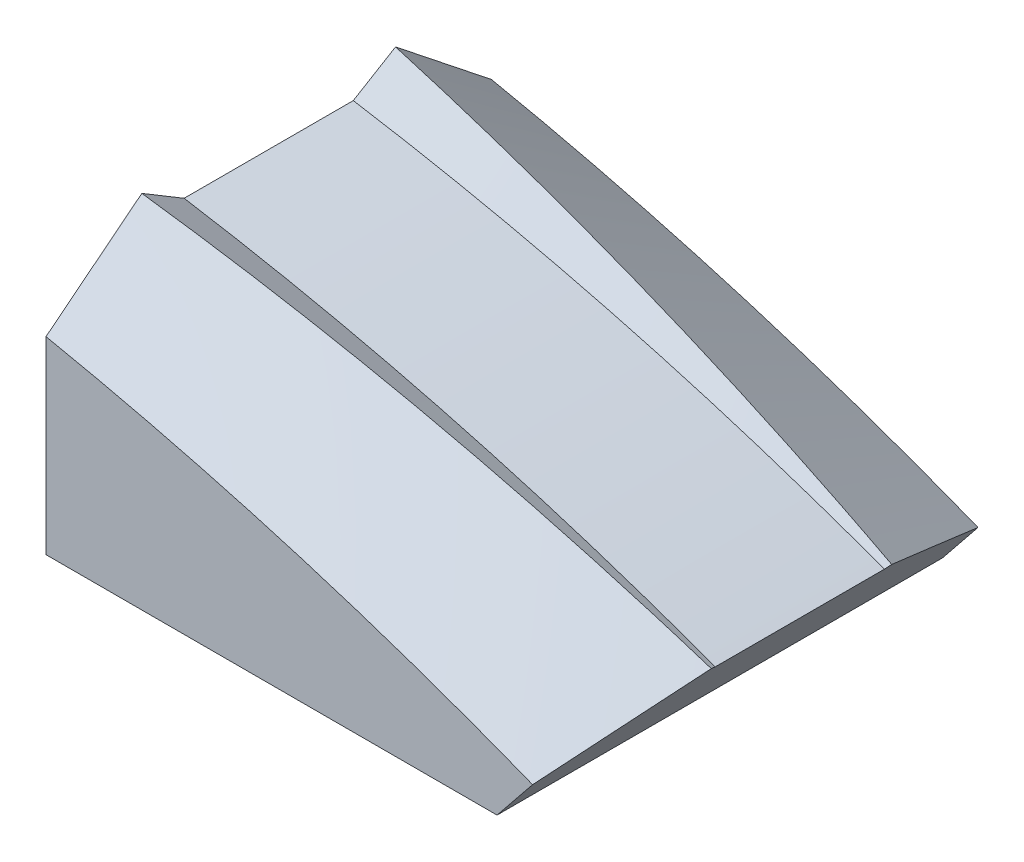
ISO-10303-21;
HEADER;
FILE_DESCRIPTION(('STEP AP214'),'2;1');
FILE_NAME('part.step','',(''),(''),'','','');
FILE_SCHEMA(('AUTOMOTIVE_DESIGN { 1 0 10303 214 1 1 1 1 }'));
ENDSEC;
DATA;
#1=APPLICATION_CONTEXT('core data for automotive mechanical design processes');
#2=APPLICATION_PROTOCOL_DEFINITION('international standard','automotive_design',2000,#1);
#3=PRODUCT_CONTEXT('',#1,'mechanical');
#4=PRODUCT('Part','Part','',(#3));
#5=PRODUCT_RELATED_PRODUCT_CATEGORY('part','',(#4));
#6=PRODUCT_DEFINITION_FORMATION('','',#4);
#7=PRODUCT_DEFINITION_CONTEXT('part definition',#1,'design');
#8=PRODUCT_DEFINITION('design','',#6,#7);
#9=PRODUCT_DEFINITION_SHAPE('','',#8);
#10=(LENGTH_UNIT() NAMED_UNIT(*) SI_UNIT(.MILLI.,.METRE.));
#11=(NAMED_UNIT(*) PLANE_ANGLE_UNIT() SI_UNIT($,.RADIAN.));
#12=(NAMED_UNIT(*) SI_UNIT($,.STERADIAN.) SOLID_ANGLE_UNIT());
#13=UNCERTAINTY_MEASURE_WITH_UNIT(LENGTH_MEASURE(1.E-05),#10,'distance_accuracy_value','');
#14=(GEOMETRIC_REPRESENTATION_CONTEXT(3) GLOBAL_UNCERTAINTY_ASSIGNED_CONTEXT((#13)) GLOBAL_UNIT_ASSIGNED_CONTEXT((#10,
#11,#12)) REPRESENTATION_CONTEXT('',''));
#15=CARTESIAN_POINT('',(0.,0.,0.));
#16=DIRECTION('',(0.,0.,1.));
#17=DIRECTION('',(1.,0.,0.));
#18=AXIS2_PLACEMENT_3D('',#15,#16,#17);
#19=CARTESIAN_POINT('',(0.,9.4,0.));
#20=DIRECTION('',(1.,0.,0.));
#21=DIRECTION('',(0.,0.,-1.));
#22=AXIS2_PLACEMENT_3D('',#19,#20,#21);
#23=PLANE('',#22);
#24=DIRECTION('',(0.,0.621882143601586,0.783110847498294));
#25=VECTOR('',#24,1.);
#26=CARTESIAN_POINT('',(0.,9.4,3.4));
#27=LINE('',#26,#25);
#28=CARTESIAN_POINT('',(0.,6.7,0.));
#29=VERTEX_POINT('',#28);
#30=CARTESIAN_POINT('',(0.,9.4,3.4));
#31=VERTEX_POINT('',#30);
#32=EDGE_CURVE('E402',#29,#31,#27,.T.);
#33=ORIENTED_EDGE('',*,*,#32,.F.);
#34=DIRECTION('',(0.,-1.,0.));
#35=VECTOR('',#34,1.);
#36=CARTESIAN_POINT('',(0.,9.4,0.));
#37=LINE('',#36,#35);
#38=CARTESIAN_POINT('',(0.,0.,0.));
#39=VERTEX_POINT('',#38);
#40=EDGE_CURVE('E368',#29,#39,#37,.T.);
#41=ORIENTED_EDGE('',*,*,#40,.T.);
#42=DIRECTION('',(0.,0.,1.));
#43=VECTOR('',#42,1.);
#44=CARTESIAN_POINT('',(0.,0.,0.));
#45=LINE('',#44,#43);
#46=CARTESIAN_POINT('',(0.,0.,15.8));
#47=VERTEX_POINT('',#46);
#48=EDGE_CURVE('E366',#39,#47,#45,.T.);
#49=ORIENTED_EDGE('',*,*,#48,.T.);
#50=DIRECTION('',(0.,-1.,0.));
#51=VECTOR('',#50,1.);
#52=CARTESIAN_POINT('',(0.,9.4,15.8));
#53=LINE('',#52,#51);
#54=CARTESIAN_POINT('',(0.,6.7,15.8));
#55=VERTEX_POINT('',#54);
#56=EDGE_CURVE('E163',#55,#47,#53,.T.);
#57=ORIENTED_EDGE('',*,*,#56,.F.);
#58=DIRECTION('',(0.,0.621882143601586,-0.783110847498294));
#59=VECTOR('',#58,1.);
#60=CARTESIAN_POINT('',(0.,4.18880839856923,18.9622412758758));
#61=LINE('',#60,#59);
#62=CARTESIAN_POINT('',(0.,9.4,12.4));
#63=VERTEX_POINT('',#62);
#64=EDGE_CURVE('E388',#55,#63,#61,.T.);
#65=ORIENTED_EDGE('',*,*,#64,.T.);
#66=DIRECTION('',(0.,0.514495755427527,0.857492925712544));
#67=VECTOR('',#66,1.);
#68=CARTESIAN_POINT('',(0.,8.5,10.9));
#69=LINE('',#68,#67);
#70=CARTESIAN_POINT('',(0.,8.5,10.9));
#71=VERTEX_POINT('',#70);
#72=EDGE_CURVE('E399',#71,#63,#69,.T.);
#73=ORIENTED_EDGE('',*,*,#72,.F.);
#74=DIRECTION('',(0.,0.,1.));
#75=VECTOR('',#74,1.);
#76=CARTESIAN_POINT('',(0.,8.5,4.9));
#77=LINE('',#76,#75);
#78=CARTESIAN_POINT('',(0.,8.5,4.9));
#79=VERTEX_POINT('',#78);
#80=EDGE_CURVE('E370',#79,#71,#77,.T.);
#81=ORIENTED_EDGE('',*,*,#80,.F.);
#82=DIRECTION('',(0.,-0.514495755427526,0.857492925712544));
#83=VECTOR('',#82,1.);
#84=CARTESIAN_POINT('',(0.,8.5,4.9));
#85=LINE('',#84,#83);
#86=EDGE_CURVE('E393',#31,#79,#85,.T.);
#87=ORIENTED_EDGE('',*,*,#86,.F.);
#88=EDGE_LOOP('',(#33,#41,#49,#57,#65,#73,#81,#87));
#89=FACE_BOUND('',#88,.T.);
#90=ADVANCED_FACE('F149',(#89),#23,.F.);
#91=CARTESIAN_POINT('',(0.,9.4,15.8));
#92=DIRECTION('',(0.,0.,-1.));
#93=DIRECTION('',(-1.,0.,0.));
#94=AXIS2_PLACEMENT_3D('',#91,#92,#93);
#95=PLANE('',#94);
#96=DIRECTION('',(1.,0.,0.));
#97=VECTOR('',#96,1.);
#98=CARTESIAN_POINT('',(0.,0.,15.8));
#99=LINE('',#98,#97);
#100=CARTESIAN_POINT('',(16.,0.,15.8));
#101=VERTEX_POINT('',#100);
#102=EDGE_CURVE('E358',#47,#101,#99,.T.);
#103=ORIENTED_EDGE('',*,*,#102,.T.);
#104=DIRECTION('',(-0.627329537872645,-0.778753909083282,0.));
#105=VECTOR('',#104,1.);
#106=CARTESIAN_POINT('',(18.9,3.6,15.8));
#107=LINE('',#106,#105);
#108=CARTESIAN_POINT('',(17.2609947401908,1.56537278092651,15.8));
#109=VERTEX_POINT('',#108);
#110=EDGE_CURVE('E278',#109,#101,#107,.T.);
#111=ORIENTED_EDGE('',*,*,#110,.F.);
#112=CARTESIAN_POINT('',(0.,6.7,15.8));
#113=CARTESIAN_POINT('',(6.4865817093124,5.3762216082445,15.8));
#114=CARTESIAN_POINT('',(12.7865817093124,3.44288827491117,15.8));
#115=CARTESIAN_POINT('',(18.9,0.9,15.8));
#116=B_SPLINE_CURVE_WITH_KNOTS('',3,(#112,#113,#114,#115),.UNSPECIFIED.,.F.,.F.,(4,4),(0.,1.),.UNSPECIFIED.);
#117=EDGE_CURVE('E404',#55,#109,#116,.T.);
#118=ORIENTED_EDGE('',*,*,#117,.F.);
#119=ORIENTED_EDGE('',*,*,#56,.T.);
#120=EDGE_LOOP('',(#103,#111,#118,#119));
#121=FACE_BOUND('',#120,.T.);
#122=ADVANCED_FACE('F347',(#121),#95,.F.);
#123=CARTESIAN_POINT('',(0.,9.4,0.));
#124=DIRECTION('',(0.,0.,1.));
#125=DIRECTION('',(1.,0.,0.));
#126=AXIS2_PLACEMENT_3D('',#123,#124,#125);
#127=PLANE('',#126);
#128=CARTESIAN_POINT('',(0.,6.7,0.));
#129=CARTESIAN_POINT('',(6.4865817093124,5.3762216082445,0.));
#130=CARTESIAN_POINT('',(12.7865817093124,3.44288827491116,0.));
#131=CARTESIAN_POINT('',(18.9,0.899999999999999,0.));
#132=B_SPLINE_CURVE_WITH_KNOTS('',3,(#128,#129,#130,#131),.UNSPECIFIED.,.F.,.F.,(4,4),(0.,1.),.UNSPECIFIED.);
#133=CARTESIAN_POINT('',(17.2609947408899,1.56537278206726,0.));
#134=VERTEX_POINT('',#133);
#135=EDGE_CURVE('E405',#29,#134,#132,.T.);
#136=ORIENTED_EDGE('',*,*,#135,.T.);
#137=DIRECTION('',(-0.627329537872645,-0.778753909083282,0.));
#138=VECTOR('',#137,1.);
#139=CARTESIAN_POINT('',(14.2955545156762,-2.11586335985027,0.));
#140=LINE('',#139,#138);
#141=CARTESIAN_POINT('',(16.,0.,0.));
#142=VERTEX_POINT('',#141);
#143=EDGE_CURVE('E178',#134,#142,#140,.T.);
#144=ORIENTED_EDGE('',*,*,#143,.T.);
#145=DIRECTION('',(-1.,0.,0.));
#146=VECTOR('',#145,1.);
#147=CARTESIAN_POINT('',(0.,0.,0.));
#148=LINE('',#147,#146);
#149=EDGE_CURVE('E365',#142,#39,#148,.T.);
#150=ORIENTED_EDGE('',*,*,#149,.T.);
#151=ORIENTED_EDGE('',*,*,#40,.F.);
#152=EDGE_LOOP('',(#136,#144,#150,#151));
#153=FACE_BOUND('',#152,.T.);
#154=ADVANCED_FACE('F344',(#153),#127,.F.);
#155=CARTESIAN_POINT('',(0.,0.,15.8));
#156=DIRECTION('',(0.,1.,0.));
#157=DIRECTION('',(0.,0.,1.));
#158=AXIS2_PLACEMENT_3D('',#155,#156,#157);
#159=PLANE('',#158);
#160=DIRECTION('',(-1.,0.,0.));
#161=VECTOR('',#160,1.);
#162=CARTESIAN_POINT('',(1.5,0.,14.3));
#163=LINE('',#162,#161);
#164=CARTESIAN_POINT('',(14.5,0.,14.3));
#165=VERTEX_POINT('',#164);
#166=CARTESIAN_POINT('',(1.5,0.,14.3));
#167=VERTEX_POINT('',#166);
#168=EDGE_CURVE('E272',#165,#167,#163,.T.);
#169=ORIENTED_EDGE('',*,*,#168,.F.);
#170=DIRECTION('',(0.,0.,1.));
#171=VECTOR('',#170,1.);
#172=CARTESIAN_POINT('',(14.5,0.,14.3));
#173=LINE('',#172,#171);
#174=CARTESIAN_POINT('',(14.5,0.,1.5));
#175=VERTEX_POINT('',#174);
#176=EDGE_CURVE('E170',#175,#165,#173,.T.);
#177=ORIENTED_EDGE('',*,*,#176,.F.);
#178=DIRECTION('',(1.,0.,0.));
#179=VECTOR('',#178,1.);
#180=CARTESIAN_POINT('',(1.5,0.,1.5));
#181=LINE('',#180,#179);
#182=CARTESIAN_POINT('',(1.5,0.,1.5));
#183=VERTEX_POINT('',#182);
#184=EDGE_CURVE('E263',#183,#175,#181,.T.);
#185=ORIENTED_EDGE('',*,*,#184,.F.);
#186=DIRECTION('',(0.,0.,-1.));
#187=VECTOR('',#186,1.);
#188=CARTESIAN_POINT('',(1.5,0.,14.3));
#189=LINE('',#188,#187);
#190=EDGE_CURVE('E266',#167,#183,#189,.T.);
#191=ORIENTED_EDGE('',*,*,#190,.F.);
#192=EDGE_LOOP('',(#169,#177,#185,#191));
#193=FACE_BOUND('',#192,.T.);
#194=ORIENTED_EDGE('',*,*,#149,.F.);
#195=DIRECTION('',(0.,0.,1.));
#196=VECTOR('',#195,1.);
#197=CARTESIAN_POINT('',(16.,0.,-9.99999999994061E-05));
#198=LINE('',#197,#196);
#199=EDGE_CURVE('E283',#142,#101,#198,.T.);
#200=ORIENTED_EDGE('',*,*,#199,.T.);
#201=ORIENTED_EDGE('',*,*,#102,.F.);
#202=ORIENTED_EDGE('',*,*,#48,.F.);
#203=EDGE_LOOP('',(#194,#200,#201,#202));
#204=FACE_BOUND('',#203,.T.);
#205=ADVANCED_FACE('F336',(#193,#204),#159,.F.);
#206=CARTESIAN_POINT('',(0.,8.5,10.9));
#207=CARTESIAN_POINT('',(6.4865817093124,7.44288827491116,10.9));
#208=CARTESIAN_POINT('',(12.7865817093124,5.7762216082445,10.9));
#209=CARTESIAN_POINT('',(18.9,3.5,10.9));
#210=CARTESIAN_POINT('',(0.,8.5,8.9));
#211=CARTESIAN_POINT('',(6.48658170931239,7.44288827491116,8.9));
#212=CARTESIAN_POINT('',(12.7865817093124,5.7762216082445,8.9));
#213=CARTESIAN_POINT('',(18.9,3.5,8.9));
#214=CARTESIAN_POINT('',(0.,8.5,6.9));
#215=CARTESIAN_POINT('',(6.48658170931239,7.44288827491116,6.9));
#216=CARTESIAN_POINT('',(12.7865817093124,5.7762216082445,6.9));
#217=CARTESIAN_POINT('',(18.9,3.5,6.9));
#218=CARTESIAN_POINT('',(0.,8.5,4.9));
#219=CARTESIAN_POINT('',(6.48658170931239,7.44288827491116,4.9));
#220=CARTESIAN_POINT('',(12.7865817093124,5.7762216082445,4.9));
#221=CARTESIAN_POINT('',(18.9,3.5,4.9));
#222=B_SPLINE_SURFACE_WITH_KNOTS('',3,3,((#206,#207,#208,#209),(#210,#211,#212,#213),(#214,#215,
#216,#217),(#218,#219,#220,#221)),.UNSPECIFIED.,.F.,.F.,.F.,(4,4),(4,4),(0.,1.),(0.,1.),.UNSPECIFIED.);
#223=CARTESIAN_POINT('',(0.,8.5,10.9));
#224=CARTESIAN_POINT('',(6.4865817093124,7.44288827491116,10.9));
#225=CARTESIAN_POINT('',(12.7865817093124,5.7762216082445,10.9));
#226=CARTESIAN_POINT('',(18.9,3.5,10.9));
#227=B_SPLINE_CURVE_WITH_KNOTS('',3,(#223,#224,#225,#226),.UNSPECIFIED.,.F.,.F.,(4,4),(0.,1.),.UNSPECIFIED.);
#228=CARTESIAN_POINT('',(18.8380166338539,3.52305513168063,10.9));
#229=VERTEX_POINT('',#228);
#230=EDGE_CURVE('E441',#229,#71,#227,.F.);
#231=DIRECTION('',(0.,0.,-1.));
#232=VECTOR('',#231,1.);
#233=CARTESIAN_POINT('',(18.8380166338539,3.52305513168063,7.9));
#234=LINE('',#233,#232);
#235=CARTESIAN_POINT('',(18.838016631898,3.52305513185555,4.9));
#236=VERTEX_POINT('',#235);
#237=EDGE_CURVE('E289',#229,#236,#234,.T.);
#238=CARTESIAN_POINT('',(0.,8.5,4.9));
#239=CARTESIAN_POINT('',(6.48658170931239,7.44288827491116,4.9));
#240=CARTESIAN_POINT('',(12.7865817093124,5.7762216082445,4.9));
#241=CARTESIAN_POINT('',(18.9,3.5,4.9));
#242=B_SPLINE_CURVE_WITH_KNOTS('',3,(#238,#239,#240,#241),.UNSPECIFIED.,.F.,.F.,(4,4),(0.,1.),.UNSPECIFIED.);
#243=EDGE_CURVE('E437',#79,#236,#242,.T.);
#244=ORIENTED_EDGE('',*,*,#230,.F.);
#245=ORIENTED_EDGE('',*,*,#237,.T.);
#246=ORIENTED_EDGE('',*,*,#243,.F.);
#247=ORIENTED_EDGE('',*,*,#80,.T.);
#248=EDGE_LOOP('',(#244,#245,#246,#247));
#249=FACE_BOUND('',#248,.T.);
#250=ADVANCED_FACE('F334',(#249),#222,.F.);
#251=CARTESIAN_POINT('',(0.,9.4,12.4));
#252=CARTESIAN_POINT('',(6.4865817093124,8.0762216082445,11.9666666666667));
#253=CARTESIAN_POINT('',(12.7865817093124,6.14288827491117,11.5333333333333));
#254=CARTESIAN_POINT('',(18.9,3.6,11.1));
#255=CARTESIAN_POINT('',(0.,9.325,12.275));
#256=CARTESIAN_POINT('',(6.4865817093124,8.02344383046672,11.8777777777778));
#257=CARTESIAN_POINT('',(12.7865817093124,6.11233271935561,11.4805555555556));
#258=CARTESIAN_POINT('',(18.9,3.59166666666667,11.0833333333333));
#259=CARTESIAN_POINT('',(0.,9.17500000000001,12.025));
#260=CARTESIAN_POINT('',(6.48658170931238,7.91788827491117,11.7));
#261=CARTESIAN_POINT('',(12.7865817093124,6.0512216082445,11.375));
#262=CARTESIAN_POINT('',(18.9,3.575,11.05));
#263=CARTESIAN_POINT('',(0.,8.95,11.65));
#264=CARTESIAN_POINT('',(6.48658170931241,7.75955494157783,11.4333333333333));
#265=CARTESIAN_POINT('',(12.7865817093124,5.95955494157783,11.2166666666667));
#266=CARTESIAN_POINT('',(18.9,3.55,11.));
#267=CARTESIAN_POINT('',(0.,8.725,11.275));
#268=CARTESIAN_POINT('',(6.48658170931239,7.6012216082445,11.1666666666667));
#269=CARTESIAN_POINT('',(12.7865817093124,5.86788827491117,11.0583333333333));
#270=CARTESIAN_POINT('',(18.9,3.525,10.95));
#271=CARTESIAN_POINT('',(0.,8.575,11.025));
#272=CARTESIAN_POINT('',(6.4865817093124,7.49566605268894,10.9888888888889));
#273=CARTESIAN_POINT('',(12.7865817093124,5.80677716380005,10.9527777777778));
#274=CARTESIAN_POINT('',(18.9,3.50833333333333,10.9166666666667));
#275=CARTESIAN_POINT('',(0.,8.5,10.9));
#276=CARTESIAN_POINT('',(6.4865817093124,7.44288827491116,10.9));
#277=CARTESIAN_POINT('',(12.7865817093124,5.7762216082445,10.9));
#278=CARTESIAN_POINT('',(18.9,3.5,10.9));
#279=B_SPLINE_SURFACE_WITH_KNOTS('',3,3,((#251,#252,#253,#254),(#255,#256,#257,#258),(#259,#260,
#261,#262),(#263,#264,#265,#266),(#267,#268,#269,#270),(#271,#272,#273,#274),(#275,#276,#277,
#278)),.UNSPECIFIED.,.F.,.F.,.F.,(4,1,1,1,4),(4,4),(0.913253710140628,0.934940282605471,
0.956626855070314,0.978313427535157,1.),(0.,1.),.UNSPECIFIED.);
#280=CARTESIAN_POINT('',(0.,9.4,12.4));
#281=CARTESIAN_POINT('',(6.4865817093124,8.0762216082445,11.9666666666667));
#282=CARTESIAN_POINT('',(12.7865817093124,6.14288827491117,11.5333333333333));
#283=CARTESIAN_POINT('',(18.9,3.6,11.1));
#284=B_SPLINE_CURVE_WITH_KNOTS('',3,(#280,#281,#282,#283),.UNSPECIFIED.,.F.,.F.,(4,4),(0.,1.),.UNSPECIFIED.);
#285=CARTESIAN_POINT('',(18.9,3.6,11.1));
#286=VERTEX_POINT('',#285);
#287=EDGE_CURVE('E387',#63,#286,#284,.T.);
#288=CARTESIAN_POINT('',(18.9,3.6,11.1));
#289=CARTESIAN_POINT('',(18.8948566609703,3.59361516534244,11.0833161418808));
#290=CARTESIAN_POINT('',(18.8897077414871,3.58722340322541,11.0666366549513));
#291=CARTESIAN_POINT('',(18.8768216580605,3.57122688586826,11.0249486895645));
#292=CARTESIAN_POINT('',(18.8690776108991,3.56161358594374,10.9999456168862));
#293=CARTESIAN_POINT('',(18.8535652173693,3.54235682156185,10.9499585573523));
#294=CARTESIAN_POINT('',(18.8457968709422,3.53271335703173,10.9249745705428));
#295=CARTESIAN_POINT('',(18.8380166337189,3.52305513151313,10.8999999995668));
#296=B_SPLINE_CURVE_WITH_KNOTS('',3,(#288,#289,#290,#291,#292,#293,#294,#295),.UNSPECIFIED.,.F.,
.F.,(4,2,2,4),(0.,0.0557686325096558,0.139421780360968,0.223075130138921),.UNSPECIFIED.);
#297=EDGE_CURVE('E326',#286,#229,#296,.T.);
#298=ORIENTED_EDGE('',*,*,#287,.T.);
#299=ORIENTED_EDGE('',*,*,#297,.T.);
#300=ORIENTED_EDGE('',*,*,#230,.T.);
#301=ORIENTED_EDGE('',*,*,#72,.T.);
#302=EDGE_LOOP('',(#298,#299,#300,#301));
#303=FACE_BOUND('',#302,.T.);
#304=ADVANCED_FACE('F328',(#303),#279,.F.);
#305=CARTESIAN_POINT('',(0.,8.5,4.9));
#306=CARTESIAN_POINT('',(6.48658170931239,7.44288827491116,4.9));
#307=CARTESIAN_POINT('',(12.7865817093124,5.7762216082445,4.9));
#308=CARTESIAN_POINT('',(18.9,3.5,4.9));
#309=CARTESIAN_POINT('',(0.,8.575,4.775));
#310=CARTESIAN_POINT('',(6.4865817093124,7.49566605268894,4.81111111111111));
#311=CARTESIAN_POINT('',(12.7865817093124,5.80677716380005,4.84722222222222));
#312=CARTESIAN_POINT('',(18.9,3.50833333333333,4.88333333333333));
#313=CARTESIAN_POINT('',(0.,8.725,4.525));
#314=CARTESIAN_POINT('',(6.4865817093124,7.6012216082445,4.63333333333334));
#315=CARTESIAN_POINT('',(12.7865817093124,5.86788827491117,4.74166666666667));
#316=CARTESIAN_POINT('',(18.9,3.52500000000001,4.85));
#317=CARTESIAN_POINT('',(0.,8.95000000000001,4.15));
#318=CARTESIAN_POINT('',(6.48658170931239,7.75955494157784,4.36666666666667));
#319=CARTESIAN_POINT('',(12.7865817093124,5.95955494157783,4.58333333333333));
#320=CARTESIAN_POINT('',(18.9,3.54999999999999,4.8));
#321=CARTESIAN_POINT('',(0.,9.17499999999999,3.775));
#322=CARTESIAN_POINT('',(6.48658170931239,7.91788827491116,4.1));
#323=CARTESIAN_POINT('',(12.7865817093124,6.0512216082445,4.425));
#324=CARTESIAN_POINT('',(18.9,3.575,4.75));
#325=CARTESIAN_POINT('',(0.,9.325,3.525));
#326=CARTESIAN_POINT('',(6.4865817093124,8.02344383046672,3.92222222222222));
#327=CARTESIAN_POINT('',(12.7865817093124,6.11233271935561,4.31944444444445));
#328=CARTESIAN_POINT('',(18.9,3.59166666666667,4.71666666666667));
#329=CARTESIAN_POINT('',(0.,9.4,3.4));
#330=CARTESIAN_POINT('',(6.48658170931239,8.0762216082445,3.83333333333333));
#331=CARTESIAN_POINT('',(12.7865817093124,6.14288827491116,4.26666666666667));
#332=CARTESIAN_POINT('',(18.9,3.6,4.7));
#333=B_SPLINE_SURFACE_WITH_KNOTS('',3,3,((#305,#306,#307,#308),(#309,#310,#311,#312),(#313,#314,
#315,#316),(#317,#318,#319,#320),(#321,#322,#323,#324),(#325,#326,#327,#328),(#329,#330,#331,
#332)),.UNSPECIFIED.,.F.,.F.,.F.,(4,1,1,1,4),(4,4),(0.,0.021686572464843,0.0433731449296861,
0.0650597173945291,0.0867462898593722),(0.,1.),.UNSPECIFIED.);
#334=CARTESIAN_POINT('',(18.838016631898,3.52305513185555,4.9));
#335=CARTESIAN_POINT('',(18.8483902394587,3.5359327117751,4.86670070782169));
#336=CARTESIAN_POINT('',(18.8587427057247,3.54878404863036,4.83338468513675));
#337=CARTESIAN_POINT('',(18.8742388285131,3.56802061463362,4.78338492118203));
#338=CARTESIAN_POINT('',(18.8793987832911,3.57442607577351,4.76671401260157));
#339=CARTESIAN_POINT('',(18.8897076854756,3.58722333373001,4.73336352687561));
#340=CARTESIAN_POINT('',(18.8948566328699,3.59361513053151,4.71668394972057));
#341=CARTESIAN_POINT('',(18.9,3.6,4.7));
#342=B_SPLINE_CURVE_WITH_KNOTS('',3,(#334,#335,#336,#337,#338,#339,#340,#341),.UNSPECIFIED.,.F.,
.F.,(4,2,2,4),(0.,0.111537315841545,0.167306189529654,0.223075124761566),.UNSPECIFIED.);
#343=CARTESIAN_POINT('',(18.9,3.6,4.7));
#344=VERTEX_POINT('',#343);
#345=EDGE_CURVE('E286',#236,#344,#342,.T.);
#346=CARTESIAN_POINT('',(0.,9.4,3.4));
#347=CARTESIAN_POINT('',(6.48658170931239,8.0762216082445,3.83333333333333));
#348=CARTESIAN_POINT('',(12.7865817093124,6.14288827491116,4.26666666666667));
#349=CARTESIAN_POINT('',(18.9,3.6,4.7));
#350=B_SPLINE_CURVE_WITH_KNOTS('',3,(#346,#347,#348,#349),.UNSPECIFIED.,.F.,.F.,(4,4),(0.,1.),.UNSPECIFIED.);
#351=EDGE_CURVE('E384',#31,#344,#350,.T.);
#352=ORIENTED_EDGE('',*,*,#243,.T.);
#353=ORIENTED_EDGE('',*,*,#345,.T.);
#354=ORIENTED_EDGE('',*,*,#351,.F.);
#355=ORIENTED_EDGE('',*,*,#86,.T.);
#356=EDGE_LOOP('',(#352,#353,#354,#355));
#357=FACE_BOUND('',#356,.T.);
#358=ADVANCED_FACE('F298',(#357),#333,.F.);
#359=CARTESIAN_POINT('',(0.,6.7,15.8));
#360=CARTESIAN_POINT('',(6.4865817093124,5.3762216082445,15.8));
#361=CARTESIAN_POINT('',(12.7865817093124,3.44288827491117,15.8));
#362=CARTESIAN_POINT('',(18.9,0.9,15.8));
#363=CARTESIAN_POINT('',(0.,6.925,15.5166666666667));
#364=CARTESIAN_POINT('',(6.4865817093124,5.6012216082445,15.4805555555556));
#365=CARTESIAN_POINT('',(12.7865817093124,3.66788827491117,15.4444444444444));
#366=CARTESIAN_POINT('',(18.9,1.125,15.4083333333333));
#367=CARTESIAN_POINT('',(0.,7.375,14.95));
#368=CARTESIAN_POINT('',(6.4865817093124,6.0512216082445,14.8416666666667));
#369=CARTESIAN_POINT('',(12.7865817093124,4.11788827491116,14.7333333333334));
#370=CARTESIAN_POINT('',(18.9,1.575,14.625));
#371=CARTESIAN_POINT('',(0.,8.05000000000001,14.1));
#372=CARTESIAN_POINT('',(6.4865817093124,6.7262216082445,13.8833333333333));
#373=CARTESIAN_POINT('',(12.7865817093124,4.79288827491117,13.6666666666667));
#374=CARTESIAN_POINT('',(18.9,2.25,13.45));
#375=CARTESIAN_POINT('',(0.,8.725,13.25));
#376=CARTESIAN_POINT('',(6.48658170931239,7.4012216082445,12.925));
#377=CARTESIAN_POINT('',(12.7865817093124,5.46788827491117,12.6));
#378=CARTESIAN_POINT('',(18.9,2.925,12.275));
#379=CARTESIAN_POINT('',(0.,9.175,12.6833333333333));
#380=CARTESIAN_POINT('',(6.4865817093124,7.8512216082445,12.2861111111111));
#381=CARTESIAN_POINT('',(12.7865817093124,5.91788827491117,11.8888888888889));
#382=CARTESIAN_POINT('',(18.9,3.375,11.4916666666667));
#383=CARTESIAN_POINT('',(0.,9.4,12.4));
#384=CARTESIAN_POINT('',(6.4865817093124,8.0762216082445,11.9666666666667));
#385=CARTESIAN_POINT('',(12.7865817093124,6.14288827491116,11.5333333333333));
#386=CARTESIAN_POINT('',(18.9,3.6,11.1));
#387=B_SPLINE_SURFACE_WITH_KNOTS('',3,3,((#359,#360,#361,#362),(#363,#364,#365,#366),(#367,#368,
#369,#370),(#371,#372,#373,#374),(#375,#376,#377,#378),(#379,#380,#381,#382),(#383,#384,#385,
#386)),.UNSPECIFIED.,.F.,.F.,.F.,(4,1,1,1,4),(4,4),(0.234591288141006,0.339415474493846,
0.444239660846686,0.549063847199526,0.653888033552365),(0.,1.),.UNSPECIFIED.);
#388=CARTESIAN_POINT('',(17.2609947364033,1.5653727825738,15.8));
#389=CARTESIAN_POINT('',(17.4019463573517,1.7403472048709,15.4081473862329));
#390=CARTESIAN_POINT('',(17.5420436936378,1.91426113772124,15.0155157902764));
#391=CARTESIAN_POINT('',(17.8205720944442,2.26002053024266,14.2287537367889));
#392=CARTESIAN_POINT('',(17.9590031595355,2.43186599062264,13.8346232797718));
#393=CARTESIAN_POINT('',(18.3675068567539,2.9389740301069,12.6625632506041));
#394=CARTESIAN_POINT('',(18.6352456049152,3.27133937468552,11.8825640293151));
#395=CARTESIAN_POINT('',(18.9,3.6,11.1));
#396=B_SPLINE_CURVE_WITH_KNOTS('',3,(#388,#389,#390,#391,#392,#393,#394,#395),.UNSPECIFIED.,.F.,
.F.,(4,2,2,4),(0.,1.35509105783078,2.71018165123066,5.37749355728828),.UNSPECIFIED.);
#397=EDGE_CURVE('E327',#109,#286,#396,.T.);
#398=ORIENTED_EDGE('',*,*,#117,.T.);
#399=ORIENTED_EDGE('',*,*,#397,.T.);
#400=ORIENTED_EDGE('',*,*,#287,.F.);
#401=ORIENTED_EDGE('',*,*,#64,.F.);
#402=EDGE_LOOP('',(#398,#399,#400,#401));
#403=FACE_BOUND('',#402,.T.);
#404=ADVANCED_FACE('F469',(#403),#387,.F.);
#405=CARTESIAN_POINT('',(0.,9.4,3.4));
#406=CARTESIAN_POINT('',(6.4865817093124,8.0762216082445,3.83333333333333));
#407=CARTESIAN_POINT('',(12.7865817093124,6.14288827491116,4.26666666666667));
#408=CARTESIAN_POINT('',(18.9,3.6,4.7));
#409=CARTESIAN_POINT('',(0.,9.175,3.11666666666667));
#410=CARTESIAN_POINT('',(6.4865817093124,7.8512216082445,3.51388888888889));
#411=CARTESIAN_POINT('',(12.7865817093124,5.91788827491116,3.91111111111111));
#412=CARTESIAN_POINT('',(18.9,3.375,4.30833333333333));
#413=CARTESIAN_POINT('',(0.,8.725,2.55));
#414=CARTESIAN_POINT('',(6.4865817093124,7.4012216082445,2.875));
#415=CARTESIAN_POINT('',(12.7865817093124,5.46788827491116,3.2));
#416=CARTESIAN_POINT('',(18.9,2.925,3.525));
#417=CARTESIAN_POINT('',(0.,8.05,1.7));
#418=CARTESIAN_POINT('',(6.4865817093124,6.7262216082445,1.91666666666667));
#419=CARTESIAN_POINT('',(12.7865817093124,4.79288827491117,2.13333333333333));
#420=CARTESIAN_POINT('',(18.9,2.25,2.35));
#421=CARTESIAN_POINT('',(0.,7.375,0.85));
#422=CARTESIAN_POINT('',(6.4865817093124,6.0512216082445,0.958333333333333));
#423=CARTESIAN_POINT('',(12.7865817093124,4.11788827491116,1.06666666666667));
#424=CARTESIAN_POINT('',(18.9,1.575,1.175));
#425=CARTESIAN_POINT('',(0.,6.925,0.283333333333333));
#426=CARTESIAN_POINT('',(6.4865817093124,5.6012216082445,0.319444444444444));
#427=CARTESIAN_POINT('',(12.7865817093124,3.66788827491116,0.355555555555555));
#428=CARTESIAN_POINT('',(18.9,1.125,0.391666666666666));
#429=CARTESIAN_POINT('',(0.,6.7,0.));
#430=CARTESIAN_POINT('',(6.4865817093124,5.3762216082445,0.));
#431=CARTESIAN_POINT('',(12.7865817093124,3.44288827491116,0.));
#432=CARTESIAN_POINT('',(18.9,0.899999999999999,0.));
#433=B_SPLINE_SURFACE_WITH_KNOTS('',3,3,((#405,#406,#407,#408),(#409,#410,#411,#412),(#413,#414,
#415,#416),(#417,#418,#419,#420),(#421,#422,#423,#424),(#425,#426,#427,#428),(#429,#430,#431,
#432)),.UNSPECIFIED.,.F.,.F.,.F.,(4,1,1,1,4),(4,4),(0.346111966447635,0.450936152800475,
0.555760339153314,0.660584525506154,0.765408711858994),(0.,1.),.UNSPECIFIED.);
#434=CARTESIAN_POINT('',(18.9,3.6,4.7));
#435=CARTESIAN_POINT('',(18.633140844415,3.26872656548072,3.91121485125193));
#436=CARTESIAN_POINT('',(18.363249787986,2.93368939198259,3.12503552529177));
#437=CARTESIAN_POINT('',(17.9535967972056,2.42515464480698,1.94996201533166));
#438=CARTESIAN_POINT('',(17.8162326094312,2.25463358412147,1.55894099635713));
#439=CARTESIAN_POINT('',(17.539857581813,1.9115473429403,0.778357646373154));
#440=CARTESIAN_POINT('',(17.4008466690228,1.73898207189042,0.388795380997046));
#441=CARTESIAN_POINT('',(17.2609947406772,1.56537278153033,-1.05459034188788E-09));
#442=B_SPLINE_CURVE_WITH_KNOTS('',3,(#434,#435,#436,#437,#438,#439,#440,#441),.UNSPECIFIED.,.F.,
.F.,(4,2,2,4),(0.,2.68851555849151,4.0329745119914,5.37749324657395),.UNSPECIFIED.);
#443=EDGE_CURVE('E13',#344,#134,#442,.T.);
#444=ORIENTED_EDGE('',*,*,#351,.T.);
#445=ORIENTED_EDGE('',*,*,#443,.T.);
#446=ORIENTED_EDGE('',*,*,#135,.F.);
#447=ORIENTED_EDGE('',*,*,#32,.T.);
#448=EDGE_LOOP('',(#444,#445,#446,#447));
#449=FACE_BOUND('',#448,.T.);
#450=ADVANCED_FACE('F308',(#449),#433,.F.);
#451=CARTESIAN_POINT('',(18.9,3.6,-9.99999999994061E-05));
#452=DIRECTION('',(-0.778753909083283,0.627329537872645,0.));
#453=DIRECTION('',(-0.627329537872645,-0.778753909083282,0.));
#454=AXIS2_PLACEMENT_3D('',#451,#452,#453);
#455=PLANE('',#454);
#456=ORIENTED_EDGE('',*,*,#110,.T.);
#457=ORIENTED_EDGE('',*,*,#199,.F.);
#458=ORIENTED_EDGE('',*,*,#143,.F.);
#459=ORIENTED_EDGE('',*,*,#443,.F.);
#460=ORIENTED_EDGE('',*,*,#345,.F.);
#461=ORIENTED_EDGE('',*,*,#237,.F.);
#462=ORIENTED_EDGE('',*,*,#297,.F.);
#463=ORIENTED_EDGE('',*,*,#397,.F.);
#464=EDGE_LOOP('',(#456,#457,#458,#459,#460,#461,#462,#463));
#465=FACE_BOUND('',#464,.T.);
#466=ADVANCED_FACE('F304',(#465),#455,.F.);
#467=CARTESIAN_POINT('',(14.5,3.,14.3));
#468=DIRECTION('',(1.,0.,0.));
#469=DIRECTION('',(0.,0.,-1.));
#470=AXIS2_PLACEMENT_3D('',#467,#468,#469);
#471=PLANE('',#470);
#472=ORIENTED_EDGE('',*,*,#176,.T.);
#473=DIRECTION('',(0.,-1.,0.));
#474=VECTOR('',#473,1.);
#475=CARTESIAN_POINT('',(14.5,3.,14.3));
#476=LINE('',#475,#474);
#477=CARTESIAN_POINT('',(14.5,3.,14.3));
#478=VERTEX_POINT('',#477);
#479=EDGE_CURVE('E241',#478,#165,#476,.T.);
#480=ORIENTED_EDGE('',*,*,#479,.F.);
#481=DIRECTION('',(0.,0.,1.));
#482=VECTOR('',#481,1.);
#483=CARTESIAN_POINT('',(14.5,3.,14.3));
#484=LINE('',#483,#482);
#485=CARTESIAN_POINT('',(14.5,3.,1.5));
#486=VERTEX_POINT('',#485);
#487=EDGE_CURVE('E245',#486,#478,#484,.T.);
#488=ORIENTED_EDGE('',*,*,#487,.F.);
#489=DIRECTION('',(0.,-1.,0.));
#490=VECTOR('',#489,1.);
#491=CARTESIAN_POINT('',(14.5,3.,1.5));
#492=LINE('',#491,#490);
#493=EDGE_CURVE('E276',#486,#175,#492,.T.);
#494=ORIENTED_EDGE('',*,*,#493,.T.);
#495=EDGE_LOOP('',(#472,#480,#488,#494));
#496=FACE_BOUND('',#495,.T.);
#497=ADVANCED_FACE('F243',(#496),#471,.F.);
#498=CARTESIAN_POINT('',(1.5,3.,1.5));
#499=DIRECTION('',(0.,0.,-1.));
#500=DIRECTION('',(-1.,0.,0.));
#501=AXIS2_PLACEMENT_3D('',#498,#499,#500);
#502=PLANE('',#501);
#503=ORIENTED_EDGE('',*,*,#184,.T.);
#504=ORIENTED_EDGE('',*,*,#493,.F.);
#505=DIRECTION('',(1.,0.,0.));
#506=VECTOR('',#505,1.);
#507=CARTESIAN_POINT('',(1.5,3.,1.5));
#508=LINE('',#507,#506);
#509=CARTESIAN_POINT('',(1.5,3.,1.5));
#510=VERTEX_POINT('',#509);
#511=EDGE_CURVE('E251',#510,#486,#508,.T.);
#512=ORIENTED_EDGE('',*,*,#511,.F.);
#513=DIRECTION('',(0.,-1.,0.));
#514=VECTOR('',#513,1.);
#515=CARTESIAN_POINT('',(1.5,3.,1.5));
#516=LINE('',#515,#514);
#517=EDGE_CURVE('E279',#510,#183,#516,.T.);
#518=ORIENTED_EDGE('',*,*,#517,.T.);
#519=EDGE_LOOP('',(#503,#504,#512,#518));
#520=FACE_BOUND('',#519,.T.);
#521=ADVANCED_FACE('F541',(#520),#502,.F.);
#522=CARTESIAN_POINT('',(1.5,3.,14.3));
#523=DIRECTION('',(-1.,0.,0.));
#524=DIRECTION('',(0.,0.,1.));
#525=AXIS2_PLACEMENT_3D('',#522,#523,#524);
#526=PLANE('',#525);
#527=ORIENTED_EDGE('',*,*,#190,.T.);
#528=ORIENTED_EDGE('',*,*,#517,.F.);
#529=DIRECTION('',(0.,0.,-1.));
#530=VECTOR('',#529,1.);
#531=CARTESIAN_POINT('',(1.5,3.,14.3));
#532=LINE('',#531,#530);
#533=CARTESIAN_POINT('',(1.5,3.,14.3));
#534=VERTEX_POINT('',#533);
#535=EDGE_CURVE('E259',#534,#510,#532,.T.);
#536=ORIENTED_EDGE('',*,*,#535,.F.);
#537=DIRECTION('',(0.,-1.,0.));
#538=VECTOR('',#537,1.);
#539=CARTESIAN_POINT('',(1.5,3.,14.3));
#540=LINE('',#539,#538);
#541=EDGE_CURVE('E250',#534,#167,#540,.T.);
#542=ORIENTED_EDGE('',*,*,#541,.T.);
#543=EDGE_LOOP('',(#527,#528,#536,#542));
#544=FACE_BOUND('',#543,.T.);
#545=ADVANCED_FACE('F549',(#544),#526,.F.);
#546=CARTESIAN_POINT('',(1.5,3.,14.3));
#547=DIRECTION('',(0.,0.,1.));
#548=DIRECTION('',(1.,0.,0.));
#549=AXIS2_PLACEMENT_3D('',#546,#547,#548);
#550=PLANE('',#549);
#551=ORIENTED_EDGE('',*,*,#168,.T.);
#552=ORIENTED_EDGE('',*,*,#541,.F.);
#553=DIRECTION('',(-1.,0.,0.));
#554=VECTOR('',#553,1.);
#555=CARTESIAN_POINT('',(1.5,3.,14.3));
#556=LINE('',#555,#554);
#557=EDGE_CURVE('E254',#478,#534,#556,.T.);
#558=ORIENTED_EDGE('',*,*,#557,.F.);
#559=ORIENTED_EDGE('',*,*,#479,.T.);
#560=EDGE_LOOP('',(#551,#552,#558,#559));
#561=FACE_BOUND('',#560,.T.);
#562=ADVANCED_FACE('F255',(#561),#550,.F.);
#563=CARTESIAN_POINT('',(14.5,3.,1.5));
#564=DIRECTION('',(0.,-1.,0.));
#565=DIRECTION('',(0.,0.,-1.));
#566=AXIS2_PLACEMENT_3D('',#563,#564,#565);
#567=PLANE('',#566);
#568=ORIENTED_EDGE('',*,*,#487,.T.);
#569=ORIENTED_EDGE('',*,*,#557,.T.);
#570=ORIENTED_EDGE('',*,*,#535,.T.);
#571=ORIENTED_EDGE('',*,*,#511,.T.);
#572=EDGE_LOOP('',(#568,#569,#570,#571));
#573=FACE_BOUND('',#572,.T.);
#574=ADVANCED_FACE('F261',(#573),#567,.T.);
#575=CLOSED_SHELL('',(#90,#122,#154,#205,#250,#304,#358,#404,#450,#466,#497,#521,#545,#562,#574));
#576=MANIFOLD_SOLID_BREP('B2',#575);
#577=ADVANCED_BREP_SHAPE_REPRESENTATION('',(#18,#576),#14);
#578=SHAPE_DEFINITION_REPRESENTATION(#9,#577);
ENDSEC;
END-ISO-10303-21;
